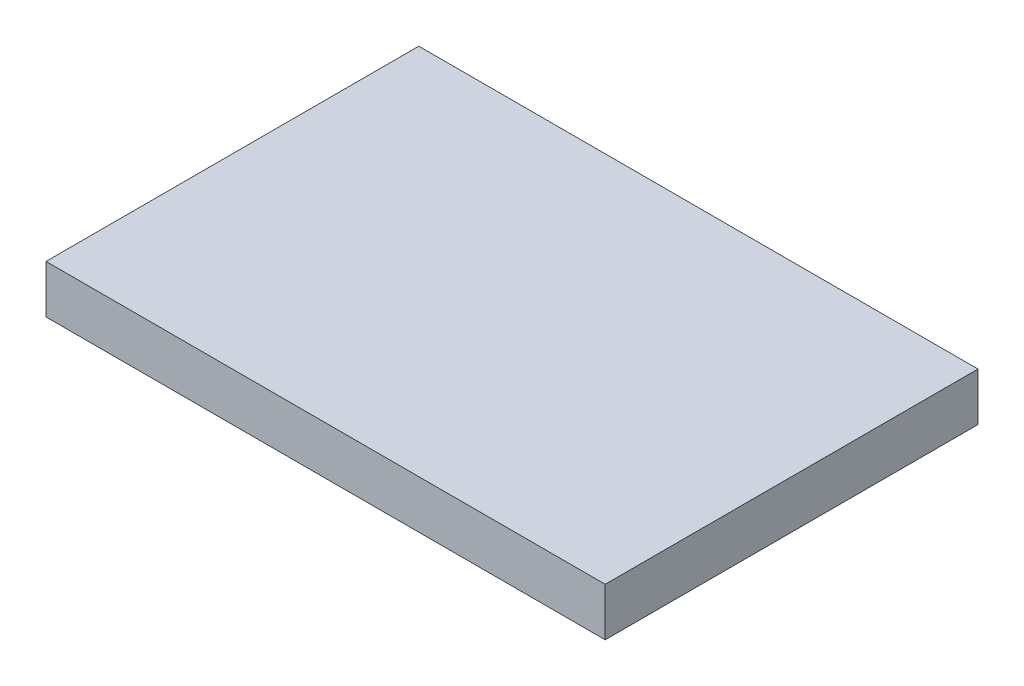
ISO-10303-21;
HEADER;
FILE_DESCRIPTION(('STEP AP214'),'2;1');
FILE_NAME('part.step','',(''),(''),'','','');
FILE_SCHEMA(('AUTOMOTIVE_DESIGN { 1 0 10303 214 1 1 1 1 }'));
ENDSEC;
DATA;
#1=APPLICATION_CONTEXT('core data for automotive mechanical design processes');
#2=APPLICATION_PROTOCOL_DEFINITION('international standard','automotive_design',2000,#1);
#3=PRODUCT_CONTEXT('',#1,'mechanical');
#4=PRODUCT('Part','Part','',(#3));
#5=PRODUCT_RELATED_PRODUCT_CATEGORY('part','',(#4));
#6=PRODUCT_DEFINITION_FORMATION('','',#4);
#7=PRODUCT_DEFINITION_CONTEXT('part definition',#1,'design');
#8=PRODUCT_DEFINITION('design','',#6,#7);
#9=PRODUCT_DEFINITION_SHAPE('','',#8);
#10=(LENGTH_UNIT() NAMED_UNIT(*) SI_UNIT(.MILLI.,.METRE.));
#11=(NAMED_UNIT(*) PLANE_ANGLE_UNIT() SI_UNIT($,.RADIAN.));
#12=(NAMED_UNIT(*) SI_UNIT($,.STERADIAN.) SOLID_ANGLE_UNIT());
#13=UNCERTAINTY_MEASURE_WITH_UNIT(LENGTH_MEASURE(1.E-05),#10,'distance_accuracy_value','');
#14=(GEOMETRIC_REPRESENTATION_CONTEXT(3) GLOBAL_UNCERTAINTY_ASSIGNED_CONTEXT((#13)) GLOBAL_UNIT_ASSIGNED_CONTEXT((#10,
#11,#12)) REPRESENTATION_CONTEXT('',''));
#15=CARTESIAN_POINT('',(0.,0.,0.));
#16=DIRECTION('',(0.,0.,1.));
#17=DIRECTION('',(1.,0.,0.));
#18=AXIS2_PLACEMENT_3D('',#15,#16,#17);
#19=CARTESIAN_POINT('',(0.,-0.8,0.));
#20=DIRECTION('',(0.,0.,-1.));
#21=DIRECTION('',(-1.,0.,0.));
#22=AXIS2_PLACEMENT_3D('',#19,#20,#21);
#23=PLANE('',#22);
#24=DIRECTION('',(-1.,0.,0.));
#25=VECTOR('',#24,1.);
#26=CARTESIAN_POINT('',(0.,0.,0.));
#27=LINE('',#26,#25);
#28=CARTESIAN_POINT('',(9.3,0.,0.));
#29=VERTEX_POINT('',#28);
#30=CARTESIAN_POINT('',(0.,0.,0.));
#31=VERTEX_POINT('',#30);
#32=EDGE_CURVE('E88',#29,#31,#27,.T.);
#33=ORIENTED_EDGE('',*,*,#32,.F.);
#34=DIRECTION('',(0.,-1.,0.));
#35=VECTOR('',#34,1.);
#36=CARTESIAN_POINT('',(9.3,0.,0.));
#37=LINE('',#36,#35);
#38=CARTESIAN_POINT('',(9.3,-0.8,0.));
#39=VERTEX_POINT('',#38);
#40=EDGE_CURVE('E74',#29,#39,#37,.T.);
#41=ORIENTED_EDGE('',*,*,#40,.T.);
#42=DIRECTION('',(-1.,0.,0.));
#43=VECTOR('',#42,1.);
#44=CARTESIAN_POINT('',(0.,-0.8,0.));
#45=LINE('',#44,#43);
#46=CARTESIAN_POINT('',(0.,-0.8,0.));
#47=VERTEX_POINT('',#46);
#48=EDGE_CURVE('E43',#39,#47,#45,.T.);
#49=ORIENTED_EDGE('',*,*,#48,.T.);
#50=DIRECTION('',(0.,1.,0.));
#51=VECTOR('',#50,1.);
#52=CARTESIAN_POINT('',(0.,-0.8,0.));
#53=LINE('',#52,#51);
#54=EDGE_CURVE('E11',#47,#31,#53,.T.);
#55=ORIENTED_EDGE('',*,*,#54,.T.);
#56=EDGE_LOOP('',(#33,#41,#49,#55));
#57=FACE_BOUND('',#56,.T.);
#58=ADVANCED_FACE('F35',(#57),#23,.T.);
#59=CARTESIAN_POINT('',(0.,-0.8,0.));
#60=DIRECTION('',(0.,1.,0.));
#61=DIRECTION('',(0.,0.,1.));
#62=AXIS2_PLACEMENT_3D('',#59,#60,#61);
#63=PLANE('',#62);
#64=DIRECTION('',(0.,0.,1.));
#65=VECTOR('',#64,1.);
#66=CARTESIAN_POINT('',(9.3,-0.8,0.));
#67=LINE('',#66,#65);
#68=CARTESIAN_POINT('',(9.3,-0.8,6.2));
#69=VERTEX_POINT('',#68);
#70=EDGE_CURVE('E80',#39,#69,#67,.T.);
#71=ORIENTED_EDGE('',*,*,#70,.T.);
#72=DIRECTION('',(1.,0.,0.));
#73=VECTOR('',#72,1.);
#74=CARTESIAN_POINT('',(0.,-0.8,6.2));
#75=LINE('',#74,#73);
#76=CARTESIAN_POINT('',(0.,-0.8,6.2));
#77=VERTEX_POINT('',#76);
#78=EDGE_CURVE('E89',#77,#69,#75,.T.);
#79=ORIENTED_EDGE('',*,*,#78,.F.);
#80=DIRECTION('',(0.,0.,1.));
#81=VECTOR('',#80,1.);
#82=CARTESIAN_POINT('',(0.,-0.8,0.));
#83=LINE('',#82,#81);
#84=EDGE_CURVE('E92',#47,#77,#83,.T.);
#85=ORIENTED_EDGE('',*,*,#84,.F.);
#86=ORIENTED_EDGE('',*,*,#48,.F.);
#87=EDGE_LOOP('',(#71,#79,#85,#86));
#88=FACE_BOUND('',#87,.T.);
#89=ADVANCED_FACE('F105',(#88),#63,.F.);
#90=CARTESIAN_POINT('',(0.,0.,0.));
#91=DIRECTION('',(0.,1.,0.));
#92=DIRECTION('',(0.,0.,1.));
#93=AXIS2_PLACEMENT_3D('',#90,#91,#92);
#94=PLANE('',#93);
#95=DIRECTION('',(1.,0.,0.));
#96=VECTOR('',#95,1.);
#97=CARTESIAN_POINT('',(0.,0.,6.2));
#98=LINE('',#97,#96);
#99=CARTESIAN_POINT('',(0.,0.,6.2));
#100=VERTEX_POINT('',#99);
#101=CARTESIAN_POINT('',(9.3,0.,6.2));
#102=VERTEX_POINT('',#101);
#103=EDGE_CURVE('E83',#100,#102,#98,.T.);
#104=ORIENTED_EDGE('',*,*,#103,.T.);
#105=DIRECTION('',(0.,0.,1.));
#106=VECTOR('',#105,1.);
#107=CARTESIAN_POINT('',(9.3,0.,0.));
#108=LINE('',#107,#106);
#109=EDGE_CURVE('E77',#29,#102,#108,.T.);
#110=ORIENTED_EDGE('',*,*,#109,.F.);
#111=ORIENTED_EDGE('',*,*,#32,.T.);
#112=DIRECTION('',(0.,0.,1.));
#113=VECTOR('',#112,1.);
#114=CARTESIAN_POINT('',(0.,0.,0.));
#115=LINE('',#114,#113);
#116=EDGE_CURVE('E93',#31,#100,#115,.T.);
#117=ORIENTED_EDGE('',*,*,#116,.T.);
#118=EDGE_LOOP('',(#104,#110,#111,#117));
#119=FACE_BOUND('',#118,.T.);
#120=ADVANCED_FACE('F86',(#119),#94,.T.);
#121=CARTESIAN_POINT('',(0.,-0.8,0.));
#122=DIRECTION('',(-1.,0.,0.));
#123=DIRECTION('',(0.,0.,1.));
#124=AXIS2_PLACEMENT_3D('',#121,#122,#123);
#125=PLANE('',#124);
#126=DIRECTION('',(0.,-1.,0.));
#127=VECTOR('',#126,1.);
#128=CARTESIAN_POINT('',(0.,0.,6.2));
#129=LINE('',#128,#127);
#130=EDGE_CURVE('E82',#100,#77,#129,.T.);
#131=ORIENTED_EDGE('',*,*,#130,.F.);
#132=ORIENTED_EDGE('',*,*,#116,.F.);
#133=ORIENTED_EDGE('',*,*,#54,.F.);
#134=ORIENTED_EDGE('',*,*,#84,.T.);
#135=EDGE_LOOP('',(#131,#132,#133,#134));
#136=FACE_BOUND('',#135,.T.);
#137=ADVANCED_FACE('F37',(#136),#125,.T.);
#138=CARTESIAN_POINT('',(9.3,0.,0.));
#139=DIRECTION('',(1.,0.,0.));
#140=DIRECTION('',(0.,0.,-1.));
#141=AXIS2_PLACEMENT_3D('',#138,#139,#140);
#142=PLANE('',#141);
#143=ORIENTED_EDGE('',*,*,#70,.F.);
#144=ORIENTED_EDGE('',*,*,#40,.F.);
#145=ORIENTED_EDGE('',*,*,#109,.T.);
#146=DIRECTION('',(0.,-1.,0.));
#147=VECTOR('',#146,1.);
#148=CARTESIAN_POINT('',(9.3,0.,6.2));
#149=LINE('',#148,#147);
#150=EDGE_CURVE('E50',#102,#69,#149,.T.);
#151=ORIENTED_EDGE('',*,*,#150,.T.);
#152=EDGE_LOOP('',(#143,#144,#145,#151));
#153=FACE_BOUND('',#152,.T.);
#154=ADVANCED_FACE('F76',(#153),#142,.T.);
#155=CARTESIAN_POINT('',(0.,0.,6.2));
#156=DIRECTION('',(0.,0.,-1.));
#157=DIRECTION('',(-1.,0.,0.));
#158=AXIS2_PLACEMENT_3D('',#155,#156,#157);
#159=PLANE('',#158);
#160=ORIENTED_EDGE('',*,*,#78,.T.);
#161=ORIENTED_EDGE('',*,*,#150,.F.);
#162=ORIENTED_EDGE('',*,*,#103,.F.);
#163=ORIENTED_EDGE('',*,*,#130,.T.);
#164=EDGE_LOOP('',(#160,#161,#162,#163));
#165=FACE_BOUND('',#164,.T.);
#166=ADVANCED_FACE('F109',(#165),#159,.F.);
#167=CLOSED_SHELL('',(#58,#89,#120,#137,#154,#166));
#168=MANIFOLD_SOLID_BREP('B2',#167);
#169=ADVANCED_BREP_SHAPE_REPRESENTATION('',(#18,#168),#14);
#170=SHAPE_DEFINITION_REPRESENTATION(#9,#169);
ENDSEC;
END-ISO-10303-21;
